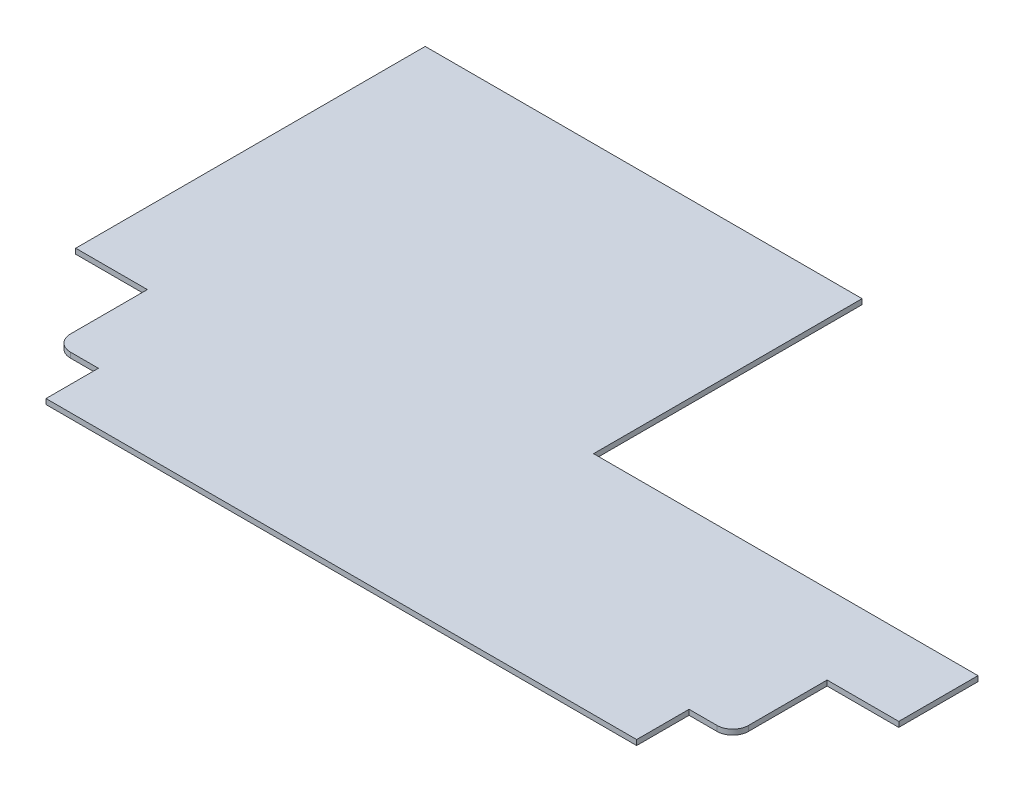
ISO-10303-21;
HEADER;
FILE_DESCRIPTION(('STEP AP214'),'2;1');
FILE_NAME('part.step','',(''),(''),'','','');
FILE_SCHEMA(('AUTOMOTIVE_DESIGN { 1 0 10303 214 1 1 1 1 }'));
ENDSEC;
DATA;
#1=APPLICATION_CONTEXT('core data for automotive mechanical design processes');
#2=APPLICATION_PROTOCOL_DEFINITION('international standard','automotive_design',2000,#1);
#3=PRODUCT_CONTEXT('',#1,'mechanical');
#4=PRODUCT('Part','Part','',(#3));
#5=PRODUCT_RELATED_PRODUCT_CATEGORY('part','',(#4));
#6=PRODUCT_DEFINITION_FORMATION('','',#4);
#7=PRODUCT_DEFINITION_CONTEXT('part definition',#1,'design');
#8=PRODUCT_DEFINITION('design','',#6,#7);
#9=PRODUCT_DEFINITION_SHAPE('','',#8);
#10=(LENGTH_UNIT() NAMED_UNIT(*) SI_UNIT(.MILLI.,.METRE.));
#11=(NAMED_UNIT(*) PLANE_ANGLE_UNIT() SI_UNIT($,.RADIAN.));
#12=(NAMED_UNIT(*) SI_UNIT($,.STERADIAN.) SOLID_ANGLE_UNIT());
#13=UNCERTAINTY_MEASURE_WITH_UNIT(LENGTH_MEASURE(1.E-05),#10,'distance_accuracy_value','');
#14=(GEOMETRIC_REPRESENTATION_CONTEXT(3) GLOBAL_UNCERTAINTY_ASSIGNED_CONTEXT((#13)) GLOBAL_UNIT_ASSIGNED_CONTEXT((#10,
#11,#12)) REPRESENTATION_CONTEXT('',''));
#15=CARTESIAN_POINT('',(0.,0.,0.));
#16=DIRECTION('',(0.,0.,1.));
#17=DIRECTION('',(1.,0.,0.));
#18=AXIS2_PLACEMENT_3D('',#15,#16,#17);
#19=CARTESIAN_POINT('',(-125.,3.,125.));
#20=DIRECTION('',(0.,0.,-1.));
#21=DIRECTION('',(-1.,0.,0.));
#22=AXIS2_PLACEMENT_3D('',#19,#20,#21);
#23=PLANE('',#22);
#24=DIRECTION('',(0.,1.,0.));
#25=VECTOR('',#24,1.);
#26=CARTESIAN_POINT('',(295.,0.,125.));
#27=LINE('',#26,#25);
#28=CARTESIAN_POINT('',(295.,0.,125.));
#29=VERTEX_POINT('',#28);
#30=CARTESIAN_POINT('',(295.,3.,125.));
#31=VERTEX_POINT('',#30);
#32=EDGE_CURVE('E225',#29,#31,#27,.T.);
#33=ORIENTED_EDGE('',*,*,#32,.T.);
#34=DIRECTION('',(1.,0.,0.));
#35=VECTOR('',#34,1.);
#36=CARTESIAN_POINT('',(-125.,3.,125.));
#37=LINE('',#36,#35);
#38=CARTESIAN_POINT('',(279.,3.,125.));
#39=VERTEX_POINT('',#38);
#40=EDGE_CURVE('E312',#39,#31,#37,.T.);
#41=ORIENTED_EDGE('',*,*,#40,.F.);
#42=DIRECTION('',(0.,1.,0.));
#43=VECTOR('',#42,1.);
#44=CARTESIAN_POINT('',(279.,-7.,125.));
#45=LINE('',#44,#43);
#46=CARTESIAN_POINT('',(279.,0.,125.));
#47=VERTEX_POINT('',#46);
#48=EDGE_CURVE('E202',#47,#39,#45,.T.);
#49=ORIENTED_EDGE('',*,*,#48,.F.);
#50=DIRECTION('',(1.,0.,0.));
#51=VECTOR('',#50,1.);
#52=CARTESIAN_POINT('',(-125.,0.,125.));
#53=LINE('',#52,#51);
#54=EDGE_CURVE('E320',#47,#29,#53,.T.);
#55=ORIENTED_EDGE('',*,*,#54,.T.);
#56=EDGE_LOOP('',(#33,#41,#49,#55));
#57=FACE_BOUND('',#56,.T.);
#58=ADVANCED_FACE('F38',(#57),#23,.F.);
#59=CARTESIAN_POINT('',(-75.,0.,125.));
#60=VERTEX_POINT('',#59);
#61=CARTESIAN_POINT('',(-59.,0.,125.));
#62=VERTEX_POINT('',#61);
#63=EDGE_CURVE('E308',#60,#62,#53,.T.);
#64=ORIENTED_EDGE('',*,*,#63,.T.);
#65=DIRECTION('',(0.,1.,0.));
#66=VECTOR('',#65,1.);
#67=CARTESIAN_POINT('',(-59.,0.,125.));
#68=LINE('',#67,#66);
#69=CARTESIAN_POINT('',(-59.,3.,125.));
#70=VERTEX_POINT('',#69);
#71=EDGE_CURVE('E248',#62,#70,#68,.T.);
#72=ORIENTED_EDGE('',*,*,#71,.T.);
#73=CARTESIAN_POINT('',(-75.,3.,125.));
#74=VERTEX_POINT('',#73);
#75=EDGE_CURVE('E47',#74,#70,#37,.T.);
#76=ORIENTED_EDGE('',*,*,#75,.F.);
#77=DIRECTION('',(0.,1.,0.));
#78=VECTOR('',#77,1.);
#79=CARTESIAN_POINT('',(-75.,0.,125.));
#80=LINE('',#79,#78);
#81=EDGE_CURVE('E256',#60,#74,#80,.T.);
#82=ORIENTED_EDGE('',*,*,#81,.F.);
#83=EDGE_LOOP('',(#64,#72,#76,#82));
#84=FACE_BOUND('',#83,.T.);
#85=ADVANCED_FACE('F343',(#84),#23,.F.);
#86=CARTESIAN_POINT('',(0.,3.,0.));
#87=DIRECTION('',(0.,1.,0.));
#88=DIRECTION('',(0.,0.,1.));
#89=AXIS2_PLACEMENT_3D('',#86,#87,#88);
#90=PLANE('',#89);
#91=DIRECTION('',(-1.,0.,0.));
#92=VECTOR('',#91,1.);
#93=CARTESIAN_POINT('',(-84.,3.,72.));
#94=LINE('',#93,#92);
#95=CARTESIAN_POINT('',(-84.,3.,72.));
#96=VERTEX_POINT('',#95);
#97=CARTESIAN_POINT('',(-125.,3.,72.));
#98=VERTEX_POINT('',#97);
#99=EDGE_CURVE('E178',#96,#98,#94,.T.);
#100=ORIENTED_EDGE('',*,*,#99,.F.);
#101=DIRECTION('',(0.,0.,-1.));
#102=VECTOR('',#101,1.);
#103=CARTESIAN_POINT('',(-84.,3.,125.));
#104=LINE('',#103,#102);
#105=CARTESIAN_POINT('',(-84.,3.,116.));
#106=VERTEX_POINT('',#105);
#107=EDGE_CURVE('E164',#106,#96,#104,.T.);
#108=ORIENTED_EDGE('',*,*,#107,.F.);
#109=CARTESIAN_POINT('',(-75.,3.,116.));
#110=DIRECTION('',(0.,-1.,0.));
#111=DIRECTION('',(0.,0.,-1.));
#112=AXIS2_PLACEMENT_3D('',#109,#110,#111);
#113=CIRCLE('',#112,8.99999999999999);
#114=EDGE_CURVE('E61',#74,#106,#113,.T.);
#115=ORIENTED_EDGE('',*,*,#114,.F.);
#116=ORIENTED_EDGE('',*,*,#75,.T.);
#117=DIRECTION('',(0.,0.,1.));
#118=VECTOR('',#117,1.);
#119=CARTESIAN_POINT('',(-59.,3.,125.));
#120=LINE('',#119,#118);
#121=CARTESIAN_POINT('',(-59.,3.,155.));
#122=VERTEX_POINT('',#121);
#123=EDGE_CURVE('E229',#70,#122,#120,.T.);
#124=ORIENTED_EDGE('',*,*,#123,.T.);
#125=DIRECTION('',(1.,0.,0.));
#126=VECTOR('',#125,1.);
#127=CARTESIAN_POINT('',(-59.,3.,155.));
#128=LINE('',#127,#126);
#129=CARTESIAN_POINT('',(279.,3.,155.));
#130=VERTEX_POINT('',#129);
#131=EDGE_CURVE('E237',#122,#130,#128,.T.);
#132=ORIENTED_EDGE('',*,*,#131,.T.);
#133=DIRECTION('',(0.,0.,1.));
#134=VECTOR('',#133,1.);
#135=CARTESIAN_POINT('',(279.,3.,125.));
#136=LINE('',#135,#134);
#137=EDGE_CURVE('E53',#39,#130,#136,.T.);
#138=ORIENTED_EDGE('',*,*,#137,.F.);
#139=ORIENTED_EDGE('',*,*,#40,.T.);
#140=CARTESIAN_POINT('',(295.,3.,116.));
#141=DIRECTION('',(0.,-1.,0.));
#142=DIRECTION('',(0.,0.,-1.));
#143=AXIS2_PLACEMENT_3D('',#140,#141,#142);
#144=CIRCLE('',#143,9.);
#145=CARTESIAN_POINT('',(304.,3.,116.));
#146=VERTEX_POINT('',#145);
#147=EDGE_CURVE('E215',#146,#31,#144,.T.);
#148=ORIENTED_EDGE('',*,*,#147,.F.);
#149=DIRECTION('',(0.,0.,1.));
#150=VECTOR('',#149,1.);
#151=CARTESIAN_POINT('',(304.,3.,116.));
#152=LINE('',#151,#150);
#153=CARTESIAN_POINT('',(304.,3.,70.9999999999999));
#154=VERTEX_POINT('',#153);
#155=EDGE_CURVE('E209',#154,#146,#152,.T.);
#156=ORIENTED_EDGE('',*,*,#155,.F.);
#157=DIRECTION('',(-1.,0.,0.));
#158=VECTOR('',#157,1.);
#159=CARTESIAN_POINT('',(304.,3.,70.9999999999999));
#160=LINE('',#159,#158);
#161=CARTESIAN_POINT('',(345.,3.,70.9999999999999));
#162=VERTEX_POINT('',#161);
#163=EDGE_CURVE('E191',#162,#154,#160,.T.);
#164=ORIENTED_EDGE('',*,*,#163,.F.);
#165=DIRECTION('',(0.,0.,-1.));
#166=VECTOR('',#165,1.);
#167=CARTESIAN_POINT('',(345.,3.,125.));
#168=LINE('',#167,#166);
#169=CARTESIAN_POINT('',(345.,3.,25.6599999999999));
#170=VERTEX_POINT('',#169);
#171=EDGE_CURVE('E163',#162,#170,#168,.T.);
#172=ORIENTED_EDGE('',*,*,#171,.T.);
#173=DIRECTION('',(-1.,0.,0.));
#174=VECTOR('',#173,1.);
#175=CARTESIAN_POINT('',(125.,3.,25.6599999999999));
#176=LINE('',#175,#174);
#177=CARTESIAN_POINT('',(125.,3.,25.6599999999999));
#178=VERTEX_POINT('',#177);
#179=EDGE_CURVE('E270',#170,#178,#176,.T.);
#180=ORIENTED_EDGE('',*,*,#179,.T.);
#181=DIRECTION('',(0.,0.,-1.));
#182=VECTOR('',#181,1.);
#183=CARTESIAN_POINT('',(125.,3.,-125.));
#184=LINE('',#183,#182);
#185=CARTESIAN_POINT('',(125.,3.,-128.));
#186=VERTEX_POINT('',#185);
#187=EDGE_CURVE('E304',#178,#186,#184,.T.);
#188=ORIENTED_EDGE('',*,*,#187,.T.);
#189=DIRECTION('',(-1.,0.,0.));
#190=VECTOR('',#189,1.);
#191=CARTESIAN_POINT('',(-125.,3.,-128.));
#192=LINE('',#191,#190);
#193=CARTESIAN_POINT('',(-125.,3.,-128.));
#194=VERTEX_POINT('',#193);
#195=EDGE_CURVE('E284',#186,#194,#192,.T.);
#196=ORIENTED_EDGE('',*,*,#195,.T.);
#197=DIRECTION('',(0.,0.,1.));
#198=VECTOR('',#197,1.);
#199=CARTESIAN_POINT('',(-125.,3.,-125.));
#200=LINE('',#199,#198);
#201=EDGE_CURVE('E307',#194,#98,#200,.T.);
#202=ORIENTED_EDGE('',*,*,#201,.T.);
#203=EDGE_LOOP('',(#100,#108,#115,#116,#124,#132,#138,#139,#148,#156,#164,#172,#180,#188,#196,#202));
#204=FACE_BOUND('',#203,.T.);
#205=ADVANCED_FACE('F338',(#204),#90,.T.);
#206=CARTESIAN_POINT('',(0.,0.,0.));
#207=DIRECTION('',(0.,1.,0.));
#208=DIRECTION('',(0.,0.,1.));
#209=AXIS2_PLACEMENT_3D('',#206,#207,#208);
#210=PLANE('',#209);
#211=DIRECTION('',(0.,0.,-1.));
#212=VECTOR('',#211,1.);
#213=CARTESIAN_POINT('',(-84.,0.,125.));
#214=LINE('',#213,#212);
#215=CARTESIAN_POINT('',(-84.,0.,116.));
#216=VERTEX_POINT('',#215);
#217=CARTESIAN_POINT('',(-84.,0.,72.));
#218=VERTEX_POINT('',#217);
#219=EDGE_CURVE('E153',#216,#218,#214,.T.);
#220=ORIENTED_EDGE('',*,*,#219,.T.);
#221=DIRECTION('',(-1.,0.,0.));
#222=VECTOR('',#221,1.);
#223=CARTESIAN_POINT('',(-84.,0.,72.));
#224=LINE('',#223,#222);
#225=CARTESIAN_POINT('',(-125.,0.,72.));
#226=VERTEX_POINT('',#225);
#227=EDGE_CURVE('E157',#218,#226,#224,.T.);
#228=ORIENTED_EDGE('',*,*,#227,.T.);
#229=DIRECTION('',(0.,0.,1.));
#230=VECTOR('',#229,1.);
#231=CARTESIAN_POINT('',(-125.,0.,-125.));
#232=LINE('',#231,#230);
#233=CARTESIAN_POINT('',(-125.,0.,-128.));
#234=VERTEX_POINT('',#233);
#235=EDGE_CURVE('E318',#234,#226,#232,.T.);
#236=ORIENTED_EDGE('',*,*,#235,.F.);
#237=DIRECTION('',(-1.,0.,0.));
#238=VECTOR('',#237,1.);
#239=CARTESIAN_POINT('',(-125.,0.,-128.));
#240=LINE('',#239,#238);
#241=CARTESIAN_POINT('',(125.,0.,-128.));
#242=VERTEX_POINT('',#241);
#243=EDGE_CURVE('E288',#242,#234,#240,.T.);
#244=ORIENTED_EDGE('',*,*,#243,.F.);
#245=DIRECTION('',(0.,0.,-1.));
#246=VECTOR('',#245,1.);
#247=CARTESIAN_POINT('',(125.,0.,-125.));
#248=LINE('',#247,#246);
#249=CARTESIAN_POINT('',(125.,0.,25.6599999999999));
#250=VERTEX_POINT('',#249);
#251=EDGE_CURVE('E300',#250,#242,#248,.T.);
#252=ORIENTED_EDGE('',*,*,#251,.F.);
#253=DIRECTION('',(-1.,0.,0.));
#254=VECTOR('',#253,1.);
#255=CARTESIAN_POINT('',(125.,0.,25.6599999999999));
#256=LINE('',#255,#254);
#257=CARTESIAN_POINT('',(345.,0.,25.6599999999999));
#258=VERTEX_POINT('',#257);
#259=EDGE_CURVE('E269',#258,#250,#256,.T.);
#260=ORIENTED_EDGE('',*,*,#259,.F.);
#261=DIRECTION('',(0.,0.,-1.));
#262=VECTOR('',#261,1.);
#263=CARTESIAN_POINT('',(345.,0.,125.));
#264=LINE('',#263,#262);
#265=CARTESIAN_POINT('',(345.,0.,70.9999999999999));
#266=VERTEX_POINT('',#265);
#267=EDGE_CURVE('E266',#266,#258,#264,.T.);
#268=ORIENTED_EDGE('',*,*,#267,.F.);
#269=DIRECTION('',(-1.,0.,0.));
#270=VECTOR('',#269,1.);
#271=CARTESIAN_POINT('',(304.,0.,70.9999999999999));
#272=LINE('',#271,#270);
#273=CARTESIAN_POINT('',(304.,0.,70.9999999999999));
#274=VERTEX_POINT('',#273);
#275=EDGE_CURVE('E186',#266,#274,#272,.T.);
#276=ORIENTED_EDGE('',*,*,#275,.T.);
#277=DIRECTION('',(0.,0.,1.));
#278=VECTOR('',#277,1.);
#279=CARTESIAN_POINT('',(304.,0.,116.));
#280=LINE('',#279,#278);
#281=CARTESIAN_POINT('',(304.,0.,116.));
#282=VERTEX_POINT('',#281);
#283=EDGE_CURVE('E210',#274,#282,#280,.T.);
#284=ORIENTED_EDGE('',*,*,#283,.T.);
#285=CARTESIAN_POINT('',(295.,0.,116.));
#286=DIRECTION('',(0.,-1.,0.));
#287=DIRECTION('',(0.,0.,-1.));
#288=AXIS2_PLACEMENT_3D('',#285,#286,#287);
#289=CIRCLE('',#288,9.);
#290=EDGE_CURVE('E214',#282,#29,#289,.T.);
#291=ORIENTED_EDGE('',*,*,#290,.T.);
#292=ORIENTED_EDGE('',*,*,#54,.F.);
#293=DIRECTION('',(0.,0.,1.));
#294=VECTOR('',#293,1.);
#295=CARTESIAN_POINT('',(279.,0.,0.));
#296=LINE('',#295,#294);
#297=CARTESIAN_POINT('',(279.,0.,155.));
#298=VERTEX_POINT('',#297);
#299=EDGE_CURVE('E205',#47,#298,#296,.T.);
#300=ORIENTED_EDGE('',*,*,#299,.T.);
#301=DIRECTION('',(1.,0.,0.));
#302=VECTOR('',#301,1.);
#303=CARTESIAN_POINT('',(-59.,0.,155.));
#304=LINE('',#303,#302);
#305=CARTESIAN_POINT('',(-59.,0.,155.));
#306=VERTEX_POINT('',#305);
#307=EDGE_CURVE('E236',#306,#298,#304,.T.);
#308=ORIENTED_EDGE('',*,*,#307,.F.);
#309=DIRECTION('',(0.,0.,1.));
#310=VECTOR('',#309,1.);
#311=CARTESIAN_POINT('',(-59.,0.,125.));
#312=LINE('',#311,#310);
#313=EDGE_CURVE('E232',#62,#306,#312,.T.);
#314=ORIENTED_EDGE('',*,*,#313,.F.);
#315=ORIENTED_EDGE('',*,*,#63,.F.);
#316=CARTESIAN_POINT('',(-75.,0.,116.));
#317=DIRECTION('',(0.,-1.,0.));
#318=DIRECTION('',(0.,0.,-1.));
#319=AXIS2_PLACEMENT_3D('',#316,#317,#318);
#320=CIRCLE('',#319,8.99999999999999);
#321=EDGE_CURVE('E160',#60,#216,#320,.T.);
#322=ORIENTED_EDGE('',*,*,#321,.T.);
#323=EDGE_LOOP('',(#220,#228,#236,#244,#252,#260,#268,#276,#284,#291,#292,#300,#308,#314,#315,#322));
#324=FACE_BOUND('',#323,.T.);
#325=ADVANCED_FACE('F155',(#324),#210,.F.);
#326=CARTESIAN_POINT('',(-84.,0.,125.));
#327=DIRECTION('',(1.,0.,0.));
#328=DIRECTION('',(0.,0.,-1.));
#329=AXIS2_PLACEMENT_3D('',#326,#327,#328);
#330=PLANE('',#329);
#331=DIRECTION('',(0.,1.,0.));
#332=VECTOR('',#331,1.);
#333=CARTESIAN_POINT('',(-84.,0.,116.));
#334=LINE('',#333,#332);
#335=EDGE_CURVE('E259',#216,#106,#334,.T.);
#336=ORIENTED_EDGE('',*,*,#335,.T.);
#337=ORIENTED_EDGE('',*,*,#107,.T.);
#338=DIRECTION('',(0.,1.,0.));
#339=VECTOR('',#338,1.);
#340=CARTESIAN_POINT('',(-84.,0.,72.));
#341=LINE('',#340,#339);
#342=EDGE_CURVE('E167',#218,#96,#341,.T.);
#343=ORIENTED_EDGE('',*,*,#342,.F.);
#344=ORIENTED_EDGE('',*,*,#219,.F.);
#345=EDGE_LOOP('',(#336,#337,#343,#344));
#346=FACE_BOUND('',#345,.T.);
#347=ADVANCED_FACE('F168',(#346),#330,.F.);
#348=CARTESIAN_POINT('',(125.,3.,-125.));
#349=DIRECTION('',(-1.,0.,0.));
#350=DIRECTION('',(0.,0.,1.));
#351=AXIS2_PLACEMENT_3D('',#348,#349,#350);
#352=PLANE('',#351);
#353=DIRECTION('',(0.,1.,0.));
#354=VECTOR('',#353,1.);
#355=CARTESIAN_POINT('',(125.,0.,25.6599999999999));
#356=LINE('',#355,#354);
#357=EDGE_CURVE('E280',#250,#178,#356,.T.);
#358=ORIENTED_EDGE('',*,*,#357,.F.);
#359=ORIENTED_EDGE('',*,*,#251,.T.);
#360=DIRECTION('',(0.,1.,0.));
#361=VECTOR('',#360,1.);
#362=CARTESIAN_POINT('',(125.,0.,-128.));
#363=LINE('',#362,#361);
#364=EDGE_CURVE('E292',#242,#186,#363,.T.);
#365=ORIENTED_EDGE('',*,*,#364,.T.);
#366=ORIENTED_EDGE('',*,*,#187,.F.);
#367=EDGE_LOOP('',(#358,#359,#365,#366));
#368=FACE_BOUND('',#367,.T.);
#369=ADVANCED_FACE('F40',(#368),#352,.F.);
#370=CARTESIAN_POINT('',(-125.,3.,-125.));
#371=DIRECTION('',(1.,0.,0.));
#372=DIRECTION('',(0.,0.,-1.));
#373=AXIS2_PLACEMENT_3D('',#370,#371,#372);
#374=PLANE('',#373);
#375=ORIENTED_EDGE('',*,*,#235,.T.);
#376=DIRECTION('',(0.,1.,0.));
#377=VECTOR('',#376,1.);
#378=CARTESIAN_POINT('',(-125.,0.,72.));
#379=LINE('',#378,#377);
#380=EDGE_CURVE('E173',#226,#98,#379,.T.);
#381=ORIENTED_EDGE('',*,*,#380,.T.);
#382=ORIENTED_EDGE('',*,*,#201,.F.);
#383=DIRECTION('',(0.,1.,0.));
#384=VECTOR('',#383,1.);
#385=CARTESIAN_POINT('',(-125.,0.,-128.));
#386=LINE('',#385,#384);
#387=EDGE_CURVE('E296',#234,#194,#386,.T.);
#388=ORIENTED_EDGE('',*,*,#387,.F.);
#389=EDGE_LOOP('',(#375,#381,#382,#388));
#390=FACE_BOUND('',#389,.T.);
#391=ADVANCED_FACE('F346',(#390),#374,.F.);
#392=CARTESIAN_POINT('',(-125.,0.,-128.));
#393=DIRECTION('',(0.,0.,-1.));
#394=DIRECTION('',(-1.,0.,0.));
#395=AXIS2_PLACEMENT_3D('',#392,#393,#394);
#396=PLANE('',#395);
#397=ORIENTED_EDGE('',*,*,#195,.F.);
#398=ORIENTED_EDGE('',*,*,#364,.F.);
#399=ORIENTED_EDGE('',*,*,#243,.T.);
#400=ORIENTED_EDGE('',*,*,#387,.T.);
#401=EDGE_LOOP('',(#397,#398,#399,#400));
#402=FACE_BOUND('',#401,.T.);
#403=ADVANCED_FACE('F354',(#402),#396,.T.);
#404=CARTESIAN_POINT('',(125.,0.,25.6599999999999));
#405=DIRECTION('',(0.,0.,-1.));
#406=DIRECTION('',(-1.,0.,0.));
#407=AXIS2_PLACEMENT_3D('',#404,#405,#406);
#408=PLANE('',#407);
#409=ORIENTED_EDGE('',*,*,#179,.F.);
#410=DIRECTION('',(0.,1.,0.));
#411=VECTOR('',#410,1.);
#412=CARTESIAN_POINT('',(345.,0.,25.6599999999999));
#413=LINE('',#412,#411);
#414=EDGE_CURVE('E274',#258,#170,#413,.T.);
#415=ORIENTED_EDGE('',*,*,#414,.F.);
#416=ORIENTED_EDGE('',*,*,#259,.T.);
#417=ORIENTED_EDGE('',*,*,#357,.T.);
#418=EDGE_LOOP('',(#409,#415,#416,#417));
#419=FACE_BOUND('',#418,.T.);
#420=ADVANCED_FACE('F358',(#419),#408,.T.);
#421=CARTESIAN_POINT('',(345.,0.,125.));
#422=DIRECTION('',(1.,0.,0.));
#423=DIRECTION('',(0.,0.,-1.));
#424=AXIS2_PLACEMENT_3D('',#421,#422,#423);
#425=PLANE('',#424);
#426=DIRECTION('',(0.,1.,0.));
#427=VECTOR('',#426,1.);
#428=CARTESIAN_POINT('',(345.,0.,70.9999999999999));
#429=LINE('',#428,#427);
#430=EDGE_CURVE('E190',#266,#162,#429,.T.);
#431=ORIENTED_EDGE('',*,*,#430,.F.);
#432=ORIENTED_EDGE('',*,*,#267,.T.);
#433=ORIENTED_EDGE('',*,*,#414,.T.);
#434=ORIENTED_EDGE('',*,*,#171,.F.);
#435=EDGE_LOOP('',(#431,#432,#433,#434));
#436=FACE_BOUND('',#435,.T.);
#437=ADVANCED_FACE('F364',(#436),#425,.T.);
#438=CARTESIAN_POINT('',(-75.,0.,116.));
#439=DIRECTION('',(0.,1.,0.));
#440=DIRECTION('',(0.,0.,1.));
#441=AXIS2_PLACEMENT_3D('',#438,#439,#440);
#442=CYLINDRICAL_SURFACE('',#441,8.99999999999999);
#443=ORIENTED_EDGE('',*,*,#114,.T.);
#444=ORIENTED_EDGE('',*,*,#335,.F.);
#445=ORIENTED_EDGE('',*,*,#321,.F.);
#446=ORIENTED_EDGE('',*,*,#81,.T.);
#447=EDGE_LOOP('',(#443,#444,#445,#446));
#448=FACE_BOUND('',#447,.T.);
#449=ADVANCED_FACE('F344',(#448),#442,.T.);
#450=CARTESIAN_POINT('',(-59.,0.,125.));
#451=DIRECTION('',(-1.,0.,0.));
#452=DIRECTION('',(0.,0.,1.));
#453=AXIS2_PLACEMENT_3D('',#450,#451,#452);
#454=PLANE('',#453);
#455=ORIENTED_EDGE('',*,*,#123,.F.);
#456=ORIENTED_EDGE('',*,*,#71,.F.);
#457=ORIENTED_EDGE('',*,*,#313,.T.);
#458=DIRECTION('',(0.,1.,0.));
#459=VECTOR('',#458,1.);
#460=CARTESIAN_POINT('',(-59.,0.,155.));
#461=LINE('',#460,#459);
#462=EDGE_CURVE('E241',#306,#122,#461,.T.);
#463=ORIENTED_EDGE('',*,*,#462,.T.);
#464=EDGE_LOOP('',(#455,#456,#457,#463));
#465=FACE_BOUND('',#464,.T.);
#466=ADVANCED_FACE('F341',(#465),#454,.T.);
#467=CARTESIAN_POINT('',(-59.,0.,155.));
#468=DIRECTION('',(0.,0.,1.));
#469=DIRECTION('',(1.,0.,0.));
#470=AXIS2_PLACEMENT_3D('',#467,#468,#469);
#471=PLANE('',#470);
#472=DIRECTION('',(0.,-1.,0.));
#473=VECTOR('',#472,1.);
#474=CARTESIAN_POINT('',(279.,0.,155.));
#475=LINE('',#474,#473);
#476=EDGE_CURVE('E11',#130,#298,#475,.T.);
#477=ORIENTED_EDGE('',*,*,#476,.F.);
#478=ORIENTED_EDGE('',*,*,#131,.F.);
#479=ORIENTED_EDGE('',*,*,#462,.F.);
#480=ORIENTED_EDGE('',*,*,#307,.T.);
#481=EDGE_LOOP('',(#477,#478,#479,#480));
#482=FACE_BOUND('',#481,.T.);
#483=ADVANCED_FACE('F336',(#482),#471,.T.);
#484=CARTESIAN_POINT('',(295.,0.,116.));
#485=DIRECTION('',(0.,1.,0.));
#486=DIRECTION('',(0.,0.,1.));
#487=AXIS2_PLACEMENT_3D('',#484,#485,#486);
#488=CYLINDRICAL_SURFACE('',#487,9.);
#489=ORIENTED_EDGE('',*,*,#147,.T.);
#490=ORIENTED_EDGE('',*,*,#32,.F.);
#491=ORIENTED_EDGE('',*,*,#290,.F.);
#492=DIRECTION('',(0.,1.,0.));
#493=VECTOR('',#492,1.);
#494=CARTESIAN_POINT('',(304.,0.,116.));
#495=LINE('',#494,#493);
#496=EDGE_CURVE('E219',#282,#146,#495,.T.);
#497=ORIENTED_EDGE('',*,*,#496,.T.);
#498=EDGE_LOOP('',(#489,#490,#491,#497));
#499=FACE_BOUND('',#498,.T.);
#500=ADVANCED_FACE('F373',(#499),#488,.T.);
#501=CARTESIAN_POINT('',(304.,0.,116.));
#502=DIRECTION('',(-1.,0.,0.));
#503=DIRECTION('',(0.,0.,1.));
#504=AXIS2_PLACEMENT_3D('',#501,#502,#503);
#505=PLANE('',#504);
#506=ORIENTED_EDGE('',*,*,#155,.T.);
#507=ORIENTED_EDGE('',*,*,#496,.F.);
#508=ORIENTED_EDGE('',*,*,#283,.F.);
#509=DIRECTION('',(0.,1.,0.));
#510=VECTOR('',#509,1.);
#511=CARTESIAN_POINT('',(304.,0.,70.9999999999999));
#512=LINE('',#511,#510);
#513=EDGE_CURVE('E181',#274,#154,#512,.T.);
#514=ORIENTED_EDGE('',*,*,#513,.T.);
#515=EDGE_LOOP('',(#506,#507,#508,#514));
#516=FACE_BOUND('',#515,.T.);
#517=ADVANCED_FACE('F370',(#516),#505,.F.);
#518=CARTESIAN_POINT('',(279.,-7.,125.));
#519=DIRECTION('',(-1.,0.,0.));
#520=DIRECTION('',(0.,0.,1.));
#521=AXIS2_PLACEMENT_3D('',#518,#519,#520);
#522=PLANE('',#521);
#523=ORIENTED_EDGE('',*,*,#48,.T.);
#524=ORIENTED_EDGE('',*,*,#137,.T.);
#525=ORIENTED_EDGE('',*,*,#476,.T.);
#526=ORIENTED_EDGE('',*,*,#299,.F.);
#527=EDGE_LOOP('',(#523,#524,#525,#526));
#528=FACE_BOUND('',#527,.T.);
#529=ADVANCED_FACE('F333',(#528),#522,.F.);
#530=CARTESIAN_POINT('',(304.,0.,70.9999999999999));
#531=DIRECTION('',(0.,0.,-1.));
#532=DIRECTION('',(-1.,0.,0.));
#533=AXIS2_PLACEMENT_3D('',#530,#531,#532);
#534=PLANE('',#533);
#535=ORIENTED_EDGE('',*,*,#163,.T.);
#536=ORIENTED_EDGE('',*,*,#513,.F.);
#537=ORIENTED_EDGE('',*,*,#275,.F.);
#538=ORIENTED_EDGE('',*,*,#430,.T.);
#539=EDGE_LOOP('',(#535,#536,#537,#538));
#540=FACE_BOUND('',#539,.T.);
#541=ADVANCED_FACE('F368',(#540),#534,.F.);
#542=CARTESIAN_POINT('',(-84.,0.,72.));
#543=DIRECTION('',(0.,0.,-1.));
#544=DIRECTION('',(-1.,0.,0.));
#545=AXIS2_PLACEMENT_3D('',#542,#543,#544);
#546=PLANE('',#545);
#547=ORIENTED_EDGE('',*,*,#99,.T.);
#548=ORIENTED_EDGE('',*,*,#380,.F.);
#549=ORIENTED_EDGE('',*,*,#227,.F.);
#550=ORIENTED_EDGE('',*,*,#342,.T.);
#551=EDGE_LOOP('',(#547,#548,#549,#550));
#552=FACE_BOUND('',#551,.T.);
#553=ADVANCED_FACE('F175',(#552),#546,.F.);
#554=CLOSED_SHELL('',(#58,#85,#205,#325,#347,#369,#391,#403,#420,#437,#449,#466,#483,#500,#517,
#529,#541,#553));
#555=MANIFOLD_SOLID_BREP('B2',#554);
#556=ADVANCED_BREP_SHAPE_REPRESENTATION('',(#18,#555),#14);
#557=SHAPE_DEFINITION_REPRESENTATION(#9,#556);
ENDSEC;
END-ISO-10303-21;
